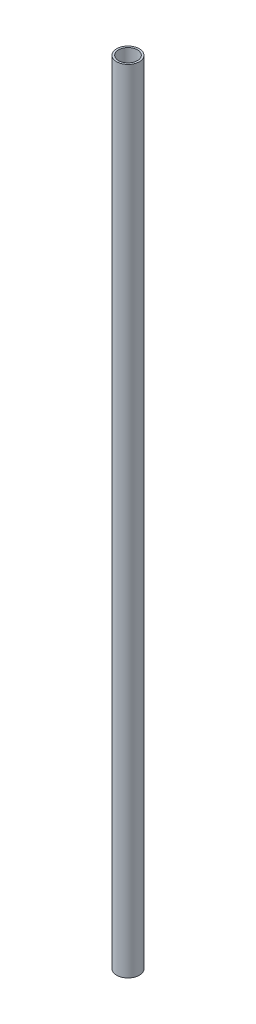
ISO-10303-21;
HEADER;
FILE_DESCRIPTION(('STEP AP214'),'2;1');
FILE_NAME('part.step','',(''),(''),'','','');
FILE_SCHEMA(('AUTOMOTIVE_DESIGN { 1 0 10303 214 1 1 1 1 }'));
ENDSEC;
DATA;
#1=APPLICATION_CONTEXT('core data for automotive mechanical design processes');
#2=APPLICATION_PROTOCOL_DEFINITION('international standard','automotive_design',2000,#1);
#3=PRODUCT_CONTEXT('',#1,'mechanical');
#4=PRODUCT('Part','Part','',(#3));
#5=PRODUCT_RELATED_PRODUCT_CATEGORY('part','',(#4));
#6=PRODUCT_DEFINITION_FORMATION('','',#4);
#7=PRODUCT_DEFINITION_CONTEXT('part definition',#1,'design');
#8=PRODUCT_DEFINITION('design','',#6,#7);
#9=PRODUCT_DEFINITION_SHAPE('','',#8);
#10=(LENGTH_UNIT() NAMED_UNIT(*) SI_UNIT(.MILLI.,.METRE.));
#11=(NAMED_UNIT(*) PLANE_ANGLE_UNIT() SI_UNIT($,.RADIAN.));
#12=(NAMED_UNIT(*) SI_UNIT($,.STERADIAN.) SOLID_ANGLE_UNIT());
#13=UNCERTAINTY_MEASURE_WITH_UNIT(LENGTH_MEASURE(1.E-05),#10,'distance_accuracy_value','');
#14=(GEOMETRIC_REPRESENTATION_CONTEXT(3) GLOBAL_UNCERTAINTY_ASSIGNED_CONTEXT((#13)) GLOBAL_UNIT_ASSIGNED_CONTEXT((#10,
#11,#12)) REPRESENTATION_CONTEXT('',''));
#15=CARTESIAN_POINT('',(0.,0.,0.));
#16=DIRECTION('',(0.,0.,1.));
#17=DIRECTION('',(1.,0.,0.));
#18=AXIS2_PLACEMENT_3D('',#15,#16,#17);
#19=CARTESIAN_POINT('',(0.,420.,0.));
#20=DIRECTION('',(0.,1.,0.));
#21=DIRECTION('',(0.,0.,1.));
#22=AXIS2_PLACEMENT_3D('',#19,#20,#21);
#23=PLANE('',#22);
#24=CARTESIAN_POINT('',(0.,420.,0.));
#25=DIRECTION('',(0.,1.,0.));
#26=DIRECTION('',(0.,0.,1.));
#27=AXIS2_PLACEMENT_3D('',#24,#25,#26);
#28=CIRCLE('',#27,6.);
#29=CARTESIAN_POINT('',(0.,420.,6.));
#30=VERTEX_POINT('',#29);
#31=EDGE_CURVE('E10',#30,#30,#28,.T.);
#32=ORIENTED_EDGE('',*,*,#31,.T.);
#33=EDGE_LOOP('',(#32));
#34=FACE_BOUND('',#33,.T.);
#35=CARTESIAN_POINT('',(0.,420.,0.));
#36=DIRECTION('',(0.,1.,0.));
#37=DIRECTION('',(0.,0.,1.));
#38=AXIS2_PLACEMENT_3D('',#35,#36,#37);
#39=CIRCLE('',#38,5.);
#40=CARTESIAN_POINT('',(0.,420.,5.));
#41=VERTEX_POINT('',#40);
#42=EDGE_CURVE('E56',#41,#41,#39,.T.);
#43=ORIENTED_EDGE('',*,*,#42,.F.);
#44=EDGE_LOOP('',(#43));
#45=FACE_BOUND('',#44,.T.);
#46=ADVANCED_FACE('F43',(#34,#45),#23,.T.);
#47=CARTESIAN_POINT('',(0.,0.,0.));
#48=DIRECTION('',(0.,1.,0.));
#49=DIRECTION('',(0.,0.,1.));
#50=AXIS2_PLACEMENT_3D('',#47,#48,#49);
#51=PLANE('',#50);
#52=CARTESIAN_POINT('',(0.,0.,0.));
#53=DIRECTION('',(0.,1.,0.));
#54=DIRECTION('',(0.,0.,1.));
#55=AXIS2_PLACEMENT_3D('',#52,#53,#54);
#56=CIRCLE('',#55,6.);
#57=CARTESIAN_POINT('',(0.,0.,6.));
#58=VERTEX_POINT('',#57);
#59=EDGE_CURVE('E47',#58,#58,#56,.T.);
#60=ORIENTED_EDGE('',*,*,#59,.F.);
#61=EDGE_LOOP('',(#60));
#62=FACE_BOUND('',#61,.T.);
#63=CARTESIAN_POINT('',(0.,0.,0.));
#64=DIRECTION('',(0.,1.,0.));
#65=DIRECTION('',(0.,0.,1.));
#66=AXIS2_PLACEMENT_3D('',#63,#64,#65);
#67=CIRCLE('',#66,5.);
#68=CARTESIAN_POINT('',(0.,0.,5.));
#69=VERTEX_POINT('',#68);
#70=EDGE_CURVE('E58',#69,#69,#67,.T.);
#71=ORIENTED_EDGE('',*,*,#70,.T.);
#72=EDGE_LOOP('',(#71));
#73=FACE_BOUND('',#72,.T.);
#74=ADVANCED_FACE('F70',(#62,#73),#51,.F.);
#75=CARTESIAN_POINT('',(0.,420.,0.));
#76=DIRECTION('',(0.,-1.,0.));
#77=DIRECTION('',(0.,0.,-1.));
#78=AXIS2_PLACEMENT_3D('',#75,#76,#77);
#79=CYLINDRICAL_SURFACE('',#78,6.);
#80=ORIENTED_EDGE('',*,*,#31,.F.);
#81=EDGE_LOOP('',(#80));
#82=FACE_BOUND('',#81,.T.);
#83=ORIENTED_EDGE('',*,*,#59,.T.);
#84=EDGE_LOOP('',(#83));
#85=FACE_BOUND('',#84,.T.);
#86=ADVANCED_FACE('F45',(#82,#85),#79,.T.);
#87=CARTESIAN_POINT('',(0.,420.,0.));
#88=DIRECTION('',(0.,-1.,0.));
#89=DIRECTION('',(0.,0.,-1.));
#90=AXIS2_PLACEMENT_3D('',#87,#88,#89);
#91=CYLINDRICAL_SURFACE('',#90,5.);
#92=ORIENTED_EDGE('',*,*,#42,.T.);
#93=EDGE_LOOP('',(#92));
#94=FACE_BOUND('',#93,.T.);
#95=ORIENTED_EDGE('',*,*,#70,.F.);
#96=EDGE_LOOP('',(#95));
#97=FACE_BOUND('',#96,.T.);
#98=ADVANCED_FACE('F66',(#94,#97),#91,.F.);
#99=CLOSED_SHELL('',(#46,#74,#86,#98));
#100=MANIFOLD_SOLID_BREP('B2',#99);
#101=ADVANCED_BREP_SHAPE_REPRESENTATION('',(#18,#100),#14);
#102=SHAPE_DEFINITION_REPRESENTATION(#9,#101);
ENDSEC;
END-ISO-10303-21;
